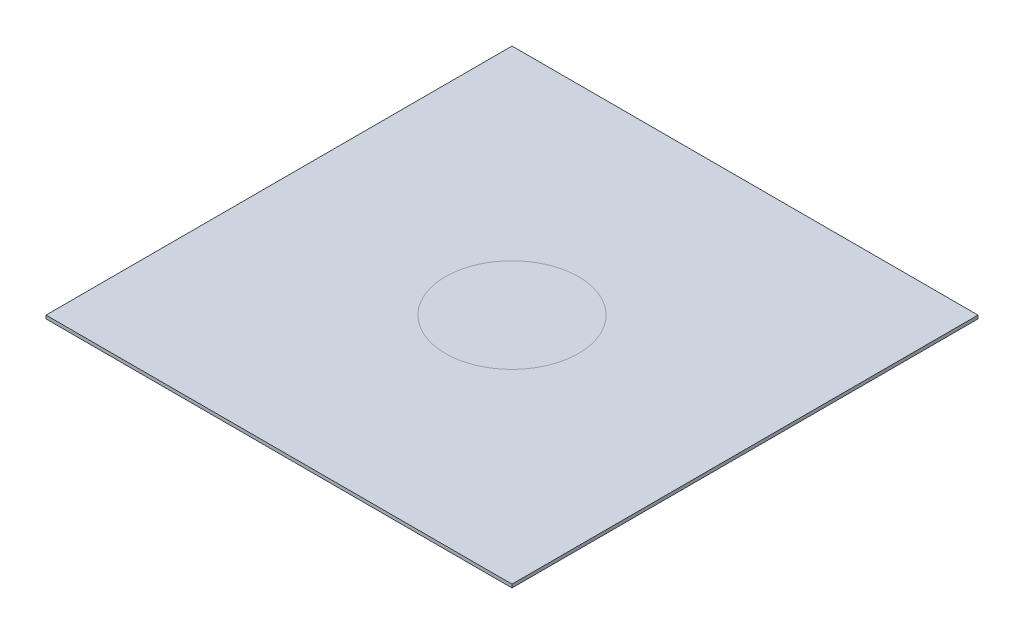
ISO-10303-21;
HEADER;
FILE_DESCRIPTION(('STEP AP214'),'2;1');
FILE_NAME('part.step','',(''),(''),'','','');
FILE_SCHEMA(('AUTOMOTIVE_DESIGN { 1 0 10303 214 1 1 1 1 }'));
ENDSEC;
DATA;
#1=APPLICATION_CONTEXT('core data for automotive mechanical design processes');
#2=APPLICATION_PROTOCOL_DEFINITION('international standard','automotive_design',2000,#1);
#3=PRODUCT_CONTEXT('',#1,'mechanical');
#4=PRODUCT('Part','Part','',(#3));
#5=PRODUCT_RELATED_PRODUCT_CATEGORY('part','',(#4));
#6=PRODUCT_DEFINITION_FORMATION('','',#4);
#7=PRODUCT_DEFINITION_CONTEXT('part definition',#1,'design');
#8=PRODUCT_DEFINITION('design','',#6,#7);
#9=PRODUCT_DEFINITION_SHAPE('','',#8);
#10=(LENGTH_UNIT() NAMED_UNIT(*) SI_UNIT(.MILLI.,.METRE.));
#11=(NAMED_UNIT(*) PLANE_ANGLE_UNIT() SI_UNIT($,.RADIAN.));
#12=(NAMED_UNIT(*) SI_UNIT($,.STERADIAN.) SOLID_ANGLE_UNIT());
#13=UNCERTAINTY_MEASURE_WITH_UNIT(LENGTH_MEASURE(1.E-05),#10,'distance_accuracy_value','');
#14=(GEOMETRIC_REPRESENTATION_CONTEXT(3) GLOBAL_UNCERTAINTY_ASSIGNED_CONTEXT((#13)) GLOBAL_UNIT_ASSIGNED_CONTEXT((#10,
#11,#12)) REPRESENTATION_CONTEXT('',''));
#15=CARTESIAN_POINT('',(0.,0.,0.));
#16=DIRECTION('',(0.,0.,1.));
#17=DIRECTION('',(1.,0.,0.));
#18=AXIS2_PLACEMENT_3D('',#15,#16,#17);
#19=CARTESIAN_POINT('',(0.,0.5,0.));
#20=DIRECTION('',(0.,-1.,0.));
#21=DIRECTION('',(0.,0.,-1.));
#22=AXIS2_PLACEMENT_3D('',#19,#20,#21);
#23=PLANE('',#22);
#24=DIRECTION('',(0.,0.,-1.));
#25=VECTOR('',#24,1.);
#26=CARTESIAN_POINT('',(70.,0.5,70.));
#27=LINE('',#26,#25);
#28=CARTESIAN_POINT('',(70.,0.5,70.));
#29=VERTEX_POINT('',#28);
#30=CARTESIAN_POINT('',(70.,0.5,-70.));
#31=VERTEX_POINT('',#30);
#32=EDGE_CURVE('E95',#29,#31,#27,.T.);
#33=ORIENTED_EDGE('',*,*,#32,.T.);
#34=DIRECTION('',(-1.,0.,0.));
#35=VECTOR('',#34,1.);
#36=CARTESIAN_POINT('',(-70.,0.5,-70.));
#37=LINE('',#36,#35);
#38=CARTESIAN_POINT('',(-70.,0.5,-70.));
#39=VERTEX_POINT('',#38);
#40=EDGE_CURVE('E90',#31,#39,#37,.T.);
#41=ORIENTED_EDGE('',*,*,#40,.T.);
#42=DIRECTION('',(0.,0.,1.));
#43=VECTOR('',#42,1.);
#44=CARTESIAN_POINT('',(-70.,0.5,70.));
#45=LINE('',#44,#43);
#46=CARTESIAN_POINT('',(-70.,0.5,70.));
#47=VERTEX_POINT('',#46);
#48=EDGE_CURVE('E93',#39,#47,#45,.T.);
#49=ORIENTED_EDGE('',*,*,#48,.T.);
#50=DIRECTION('',(1.,0.,0.));
#51=VECTOR('',#50,1.);
#52=CARTESIAN_POINT('',(-70.,0.5,70.));
#53=LINE('',#52,#51);
#54=EDGE_CURVE('E59',#47,#29,#53,.T.);
#55=ORIENTED_EDGE('',*,*,#54,.T.);
#56=EDGE_LOOP('',(#33,#41,#49,#55));
#57=FACE_BOUND('',#56,.T.);
#58=CARTESIAN_POINT('',(0.,0.5,0.));
#59=DIRECTION('',(0.,-1.,0.));
#60=DIRECTION('',(0.,0.,-1.));
#61=AXIS2_PLACEMENT_3D('',#58,#59,#60);
#62=CIRCLE('',#61,20.);
#63=CARTESIAN_POINT('',(0.,0.5,-20.));
#64=VERTEX_POINT('',#63);
#65=EDGE_CURVE('E11',#64,#64,#62,.F.);
#66=ORIENTED_EDGE('',*,*,#65,.F.);
#67=EDGE_LOOP('',(#66));
#68=FACE_BOUND('',#67,.T.);
#69=ADVANCED_FACE('F41',(#57,#68),#23,.F.);
#70=CARTESIAN_POINT('',(70.,0.5,70.));
#71=DIRECTION('',(-1.,0.,0.));
#72=DIRECTION('',(0.,0.,1.));
#73=AXIS2_PLACEMENT_3D('',#70,#71,#72);
#74=PLANE('',#73);
#75=DIRECTION('',(0.,0.,-1.));
#76=VECTOR('',#75,1.);
#77=CARTESIAN_POINT('',(70.,-0.5,70.));
#78=LINE('',#77,#76);
#79=CARTESIAN_POINT('',(70.,-0.5,70.));
#80=VERTEX_POINT('',#79);
#81=CARTESIAN_POINT('',(70.,-0.5,-70.));
#82=VERTEX_POINT('',#81);
#83=EDGE_CURVE('E109',#80,#82,#78,.T.);
#84=ORIENTED_EDGE('',*,*,#83,.T.);
#85=DIRECTION('',(0.,-1.,0.));
#86=VECTOR('',#85,1.);
#87=CARTESIAN_POINT('',(70.,0.5,-70.));
#88=LINE('',#87,#86);
#89=EDGE_CURVE('E51',#31,#82,#88,.T.);
#90=ORIENTED_EDGE('',*,*,#89,.F.);
#91=ORIENTED_EDGE('',*,*,#32,.F.);
#92=DIRECTION('',(0.,-1.,0.));
#93=VECTOR('',#92,1.);
#94=CARTESIAN_POINT('',(70.,0.5,70.));
#95=LINE('',#94,#93);
#96=EDGE_CURVE('E105',#29,#80,#95,.T.);
#97=ORIENTED_EDGE('',*,*,#96,.T.);
#98=EDGE_LOOP('',(#84,#90,#91,#97));
#99=FACE_BOUND('',#98,.T.);
#100=ADVANCED_FACE('F43',(#99),#74,.F.);
#101=CARTESIAN_POINT('',(-70.,0.5,-70.));
#102=DIRECTION('',(0.,0.,1.));
#103=DIRECTION('',(1.,0.,0.));
#104=AXIS2_PLACEMENT_3D('',#101,#102,#103);
#105=PLANE('',#104);
#106=DIRECTION('',(-1.,0.,0.));
#107=VECTOR('',#106,1.);
#108=CARTESIAN_POINT('',(-70.,-0.5,-70.));
#109=LINE('',#108,#107);
#110=CARTESIAN_POINT('',(-70.,-0.5,-70.));
#111=VERTEX_POINT('',#110);
#112=EDGE_CURVE('E100',#82,#111,#109,.T.);
#113=ORIENTED_EDGE('',*,*,#112,.T.);
#114=DIRECTION('',(0.,-1.,0.));
#115=VECTOR('',#114,1.);
#116=CARTESIAN_POINT('',(-70.,0.5,-70.));
#117=LINE('',#116,#115);
#118=EDGE_CURVE('E98',#39,#111,#117,.T.);
#119=ORIENTED_EDGE('',*,*,#118,.F.);
#120=ORIENTED_EDGE('',*,*,#40,.F.);
#121=ORIENTED_EDGE('',*,*,#89,.T.);
#122=EDGE_LOOP('',(#113,#119,#120,#121));
#123=FACE_BOUND('',#122,.T.);
#124=ADVANCED_FACE('F99',(#123),#105,.F.);
#125=CARTESIAN_POINT('',(-70.,0.5,70.));
#126=DIRECTION('',(1.,0.,0.));
#127=DIRECTION('',(0.,0.,-1.));
#128=AXIS2_PLACEMENT_3D('',#125,#126,#127);
#129=PLANE('',#128);
#130=DIRECTION('',(0.,0.,1.));
#131=VECTOR('',#130,1.);
#132=CARTESIAN_POINT('',(-70.,-0.5,70.));
#133=LINE('',#132,#131);
#134=CARTESIAN_POINT('',(-70.,-0.5,70.));
#135=VERTEX_POINT('',#134);
#136=EDGE_CURVE('E76',#111,#135,#133,.T.);
#137=ORIENTED_EDGE('',*,*,#136,.T.);
#138=DIRECTION('',(0.,-1.,0.));
#139=VECTOR('',#138,1.);
#140=CARTESIAN_POINT('',(-70.,0.5,70.));
#141=LINE('',#140,#139);
#142=EDGE_CURVE('E101',#47,#135,#141,.T.);
#143=ORIENTED_EDGE('',*,*,#142,.F.);
#144=ORIENTED_EDGE('',*,*,#48,.F.);
#145=ORIENTED_EDGE('',*,*,#118,.T.);
#146=EDGE_LOOP('',(#137,#143,#144,#145));
#147=FACE_BOUND('',#146,.T.);
#148=ADVANCED_FACE('F103',(#147),#129,.F.);
#149=CARTESIAN_POINT('',(-70.,0.5,70.));
#150=DIRECTION('',(0.,0.,-1.));
#151=DIRECTION('',(-1.,0.,0.));
#152=AXIS2_PLACEMENT_3D('',#149,#150,#151);
#153=PLANE('',#152);
#154=DIRECTION('',(1.,0.,0.));
#155=VECTOR('',#154,1.);
#156=CARTESIAN_POINT('',(-70.,-0.5,70.));
#157=LINE('',#156,#155);
#158=EDGE_CURVE('E82',#135,#80,#157,.T.);
#159=ORIENTED_EDGE('',*,*,#158,.T.);
#160=ORIENTED_EDGE('',*,*,#96,.F.);
#161=ORIENTED_EDGE('',*,*,#54,.F.);
#162=ORIENTED_EDGE('',*,*,#142,.T.);
#163=EDGE_LOOP('',(#159,#160,#161,#162));
#164=FACE_BOUND('',#163,.T.);
#165=ADVANCED_FACE('F126',(#164),#153,.F.);
#166=ORIENTED_EDGE('',*,*,#65,.T.);
#167=EDGE_LOOP('',(#166));
#168=FACE_BOUND('',#167,.T.);
#169=ADVANCED_FACE('F121',(#168),#23,.F.);
#170=CARTESIAN_POINT('',(0.,-0.5,0.));
#171=DIRECTION('',(0.,-1.,0.));
#172=DIRECTION('',(0.,0.,-1.));
#173=AXIS2_PLACEMENT_3D('',#170,#171,#172);
#174=PLANE('',#173);
#175=ORIENTED_EDGE('',*,*,#83,.F.);
#176=ORIENTED_EDGE('',*,*,#158,.F.);
#177=ORIENTED_EDGE('',*,*,#136,.F.);
#178=ORIENTED_EDGE('',*,*,#112,.F.);
#179=EDGE_LOOP('',(#175,#176,#177,#178));
#180=FACE_BOUND('',#179,.T.);
#181=ADVANCED_FACE('F119',(#180),#174,.T.);
#182=CLOSED_SHELL('',(#69,#100,#124,#148,#165,#169,#181));
#183=MANIFOLD_SOLID_BREP('B2',#182);
#184=ADVANCED_BREP_SHAPE_REPRESENTATION('',(#18,#183),#14);
#185=SHAPE_DEFINITION_REPRESENTATION(#9,#184);
ENDSEC;
END-ISO-10303-21;
